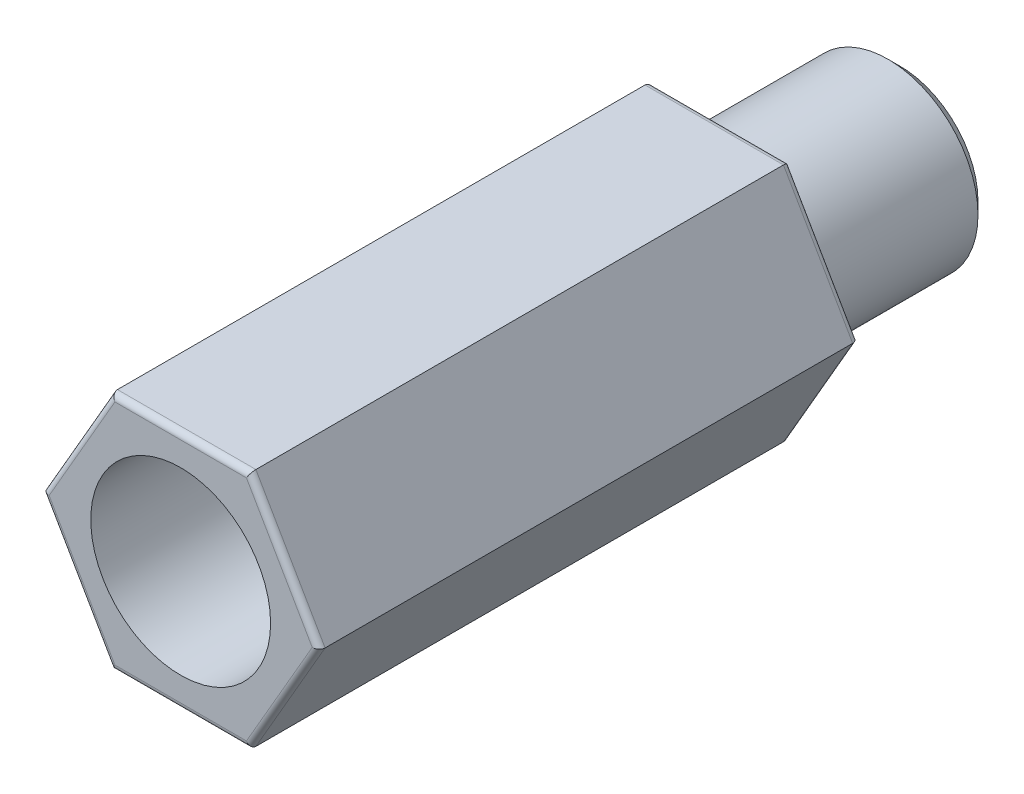
ISO-10303-21;
HEADER;
FILE_DESCRIPTION(('STEP AP214'),'2;1');
FILE_NAME('part.step','',(''),(''),'','','');
FILE_SCHEMA(('AUTOMOTIVE_DESIGN { 1 0 10303 214 1 1 1 1 }'));
ENDSEC;
DATA;
#1=APPLICATION_CONTEXT('core data for automotive mechanical design processes');
#2=APPLICATION_PROTOCOL_DEFINITION('international standard','automotive_design',2000,#1);
#3=PRODUCT_CONTEXT('',#1,'mechanical');
#4=PRODUCT('Part','Part','',(#3));
#5=PRODUCT_RELATED_PRODUCT_CATEGORY('part','',(#4));
#6=PRODUCT_DEFINITION_FORMATION('','',#4);
#7=PRODUCT_DEFINITION_CONTEXT('part definition',#1,'design');
#8=PRODUCT_DEFINITION('design','',#6,#7);
#9=PRODUCT_DEFINITION_SHAPE('','',#8);
#10=(LENGTH_UNIT() NAMED_UNIT(*) SI_UNIT(.MILLI.,.METRE.));
#11=(NAMED_UNIT(*) PLANE_ANGLE_UNIT() SI_UNIT($,.RADIAN.));
#12=(NAMED_UNIT(*) SI_UNIT($,.STERADIAN.) SOLID_ANGLE_UNIT());
#13=UNCERTAINTY_MEASURE_WITH_UNIT(LENGTH_MEASURE(1.E-05),#10,'distance_accuracy_value','');
#14=(GEOMETRIC_REPRESENTATION_CONTEXT(3) GLOBAL_UNCERTAINTY_ASSIGNED_CONTEXT((#13)) GLOBAL_UNIT_ASSIGNED_CONTEXT((#10,
#11,#12)) REPRESENTATION_CONTEXT('',''));
#15=CARTESIAN_POINT('',(0.,0.,0.));
#16=DIRECTION('',(0.,0.,1.));
#17=DIRECTION('',(1.,0.,0.));
#18=AXIS2_PLACEMENT_3D('',#15,#16,#17);
#19=CARTESIAN_POINT('',(0.,0.,12.));
#20=DIRECTION('',(0.,0.,1.));
#21=DIRECTION('',(1.,0.,0.));
#22=AXIS2_PLACEMENT_3D('',#19,#20,#21);
#23=PLANE('',#22);
#24=DIRECTION('',(1.,0.,0.));
#25=VECTOR('',#24,1.);
#26=CARTESIAN_POINT('',(1.15470053837925,-1.9,12.));
#27=LINE('',#26,#25);
#28=CARTESIAN_POINT('',(-1.09696551146029,-1.9,12.));
#29=VERTEX_POINT('',#28);
#30=CARTESIAN_POINT('',(1.09696551146029,-1.9,12.));
#31=VERTEX_POINT('',#30);
#32=EDGE_CURVE('E55',#29,#31,#27,.T.);
#33=ORIENTED_EDGE('',*,*,#32,.T.);
#34=DIRECTION('',(0.5,0.866025403784439,0.));
#35=VECTOR('',#34,1.);
#36=CARTESIAN_POINT('',(2.22279853638006,0.0500000000000011,12.));
#37=LINE('',#36,#35);
#38=CARTESIAN_POINT('',(2.19393102292058,0.,12.));
#39=VERTEX_POINT('',#38);
#40=EDGE_CURVE('E12',#31,#39,#37,.T.);
#41=ORIENTED_EDGE('',*,*,#40,.T.);
#42=DIRECTION('',(-0.5,0.866025403784438,0.));
#43=VECTOR('',#42,1.);
#44=CARTESIAN_POINT('',(1.06809799800081,1.95,12.));
#45=LINE('',#44,#43);
#46=CARTESIAN_POINT('',(1.09696551146029,1.9,12.));
#47=VERTEX_POINT('',#46);
#48=EDGE_CURVE('E197',#39,#47,#45,.T.);
#49=ORIENTED_EDGE('',*,*,#48,.T.);
#50=DIRECTION('',(-1.,0.,0.));
#51=VECTOR('',#50,1.);
#52=CARTESIAN_POINT('',(-1.15470053837925,1.9,12.));
#53=LINE('',#52,#51);
#54=CARTESIAN_POINT('',(-1.09696551146029,1.9,12.));
#55=VERTEX_POINT('',#54);
#56=EDGE_CURVE('E199',#47,#55,#53,.T.);
#57=ORIENTED_EDGE('',*,*,#56,.T.);
#58=DIRECTION('',(-0.5,-0.866025403784439,0.));
#59=VECTOR('',#58,1.);
#60=CARTESIAN_POINT('',(-2.22279853638006,-0.0499999999999996,12.));
#61=LINE('',#60,#59);
#62=CARTESIAN_POINT('',(-2.19393102292058,0.,12.));
#63=VERTEX_POINT('',#62);
#64=EDGE_CURVE('E201',#55,#63,#61,.T.);
#65=ORIENTED_EDGE('',*,*,#64,.T.);
#66=DIRECTION('',(0.5,-0.866025403784439,0.));
#67=VECTOR('',#66,1.);
#68=CARTESIAN_POINT('',(-1.06809799800081,-1.95,12.));
#69=LINE('',#68,#67);
#70=EDGE_CURVE('E66',#63,#29,#69,.T.);
#71=ORIENTED_EDGE('',*,*,#70,.T.);
#72=EDGE_LOOP('',(#33,#41,#49,#57,#65,#71));
#73=FACE_BOUND('',#72,.T.);
#74=CARTESIAN_POINT('',(0.,0.,12.));
#75=DIRECTION('',(0.,0.,1.));
#76=DIRECTION('',(1.,0.,0.));
#77=AXIS2_PLACEMENT_3D('',#74,#75,#76);
#78=CIRCLE('',#77,1.5);
#79=CARTESIAN_POINT('',(1.5,0.,12.));
#80=VERTEX_POINT('',#79);
#81=EDGE_CURVE('E215',#80,#80,#78,.T.);
#82=ORIENTED_EDGE('',*,*,#81,.F.);
#83=EDGE_LOOP('',(#82));
#84=FACE_BOUND('',#83,.T.);
#85=ADVANCED_FACE('F46',(#73,#84),#23,.T.);
#86=CARTESIAN_POINT('',(0.,0.,3.));
#87=DIRECTION('',(0.,0.,1.));
#88=DIRECTION('',(1.,0.,0.));
#89=AXIS2_PLACEMENT_3D('',#86,#87,#88);
#90=PLANE('',#89);
#91=CARTESIAN_POINT('',(0.,0.,3.));
#92=DIRECTION('',(0.,0.,1.));
#93=DIRECTION('',(1.,0.,0.));
#94=AXIS2_PLACEMENT_3D('',#91,#92,#93);
#95=CIRCLE('',#94,1.6);
#96=CARTESIAN_POINT('',(1.6,0.,3.));
#97=VERTEX_POINT('',#96);
#98=EDGE_CURVE('E162',#97,#97,#95,.T.);
#99=ORIENTED_EDGE('',*,*,#98,.T.);
#100=EDGE_LOOP('',(#99));
#101=FACE_BOUND('',#100,.T.);
#102=DIRECTION('',(-1.,0.,0.));
#103=VECTOR('',#102,1.);
#104=CARTESIAN_POINT('',(0.,1.9,3.));
#105=LINE('',#104,#103);
#106=CARTESIAN_POINT('',(-1.09696551146029,1.9,3.));
#107=VERTEX_POINT('',#106);
#108=CARTESIAN_POINT('',(1.09696551146029,1.9,3.));
#109=VERTEX_POINT('',#108);
#110=EDGE_CURVE('E161',#107,#109,#105,.F.);
#111=ORIENTED_EDGE('',*,*,#110,.T.);
#112=DIRECTION('',(-0.5,0.866025403784438,0.));
#113=VECTOR('',#112,1.);
#114=CARTESIAN_POINT('',(1.64544826719043,0.950000000000001,3.));
#115=LINE('',#114,#113);
#116=CARTESIAN_POINT('',(2.19393102292058,0.,3.));
#117=VERTEX_POINT('',#116);
#118=EDGE_CURVE('E140',#109,#117,#115,.F.);
#119=ORIENTED_EDGE('',*,*,#118,.T.);
#120=DIRECTION('',(0.5,0.866025403784439,0.));
#121=VECTOR('',#120,1.);
#122=CARTESIAN_POINT('',(1.64544826719043,-0.95,3.));
#123=LINE('',#122,#121);
#124=CARTESIAN_POINT('',(1.09696551146029,-1.9,3.));
#125=VERTEX_POINT('',#124);
#126=EDGE_CURVE('E150',#117,#125,#123,.F.);
#127=ORIENTED_EDGE('',*,*,#126,.T.);
#128=DIRECTION('',(1.,0.,0.));
#129=VECTOR('',#128,1.);
#130=CARTESIAN_POINT('',(0.,-1.9,3.));
#131=LINE('',#130,#129);
#132=CARTESIAN_POINT('',(-1.09696551146029,-1.9,3.));
#133=VERTEX_POINT('',#132);
#134=EDGE_CURVE('E156',#125,#133,#131,.F.);
#135=ORIENTED_EDGE('',*,*,#134,.T.);
#136=DIRECTION('',(0.5,-0.866025403784439,0.));
#137=VECTOR('',#136,1.);
#138=CARTESIAN_POINT('',(-1.64544826719043,-0.95,3.));
#139=LINE('',#138,#137);
#140=CARTESIAN_POINT('',(-2.19393102292058,0.,3.));
#141=VERTEX_POINT('',#140);
#142=EDGE_CURVE('E263',#133,#141,#139,.F.);
#143=ORIENTED_EDGE('',*,*,#142,.T.);
#144=DIRECTION('',(-0.5,-0.866025403784439,0.));
#145=VECTOR('',#144,1.);
#146=CARTESIAN_POINT('',(-1.64544826719043,0.95,3.));
#147=LINE('',#146,#145);
#148=EDGE_CURVE('E167',#141,#107,#147,.F.);
#149=ORIENTED_EDGE('',*,*,#148,.T.);
#150=EDGE_LOOP('',(#111,#119,#127,#135,#143,#149));
#151=FACE_BOUND('',#150,.T.);
#152=ADVANCED_FACE('F159',(#101,#151),#90,.F.);
#153=CARTESIAN_POINT('',(1.15470053837925,-2.,12.));
#154=DIRECTION('',(-0.866025403784439,0.5,0.));
#155=DIRECTION('',(-0.5,-0.866025403784439,0.));
#156=AXIS2_PLACEMENT_3D('',#153,#154,#155);
#157=PLANE('',#156);
#158=DIRECTION('',(0.,0.,-1.));
#159=VECTOR('',#158,1.);
#160=CARTESIAN_POINT('',(1.15470053837925,-2.,12.));
#161=LINE('',#160,#159);
#162=CARTESIAN_POINT('',(1.15470053837925,-2.,11.9));
#163=VERTEX_POINT('',#162);
#164=CARTESIAN_POINT('',(1.15470053837925,-2.,3.1));
#165=VERTEX_POINT('',#164);
#166=EDGE_CURVE('E296',#163,#165,#161,.T.);
#167=ORIENTED_EDGE('',*,*,#166,.T.);
#168=DIRECTION('',(0.5,0.866025403784439,0.));
#169=VECTOR('',#168,1.);
#170=CARTESIAN_POINT('',(1.15470053837925,-2.,3.1));
#171=LINE('',#170,#169);
#172=CARTESIAN_POINT('',(2.3094010767585,0.,3.1));
#173=VERTEX_POINT('',#172);
#174=EDGE_CURVE('E195',#165,#173,#171,.T.);
#175=ORIENTED_EDGE('',*,*,#174,.T.);
#176=DIRECTION('',(0.,0.,-1.));
#177=VECTOR('',#176,1.);
#178=CARTESIAN_POINT('',(2.3094010767585,0.,12.));
#179=LINE('',#178,#177);
#180=CARTESIAN_POINT('',(2.3094010767585,0.,11.9));
#181=VERTEX_POINT('',#180);
#182=EDGE_CURVE('E157',#181,#173,#179,.T.);
#183=ORIENTED_EDGE('',*,*,#182,.F.);
#184=DIRECTION('',(0.5,0.866025403784439,0.));
#185=VECTOR('',#184,1.);
#186=CARTESIAN_POINT('',(1.15470053837925,-2.,11.9));
#187=LINE('',#186,#185);
#188=EDGE_CURVE('E192',#181,#163,#187,.F.);
#189=ORIENTED_EDGE('',*,*,#188,.T.);
#190=EDGE_LOOP('',(#167,#175,#183,#189));
#191=FACE_BOUND('',#190,.T.);
#192=ADVANCED_FACE('F280',(#191),#157,.F.);
#193=CARTESIAN_POINT('',(2.3094010767585,0.,12.));
#194=DIRECTION('',(-0.866025403784438,-0.5,0.));
#195=DIRECTION('',(0.5,-0.866025403784438,0.));
#196=AXIS2_PLACEMENT_3D('',#193,#194,#195);
#197=PLANE('',#196);
#198=ORIENTED_EDGE('',*,*,#182,.T.);
#199=DIRECTION('',(-0.5,0.866025403784438,0.));
#200=VECTOR('',#199,1.);
#201=CARTESIAN_POINT('',(2.3094010767585,0.,3.1));
#202=LINE('',#201,#200);
#203=CARTESIAN_POINT('',(1.15470053837925,2.,3.1));
#204=VERTEX_POINT('',#203);
#205=EDGE_CURVE('E143',#173,#204,#202,.T.);
#206=ORIENTED_EDGE('',*,*,#205,.T.);
#207=DIRECTION('',(0.,0.,-1.));
#208=VECTOR('',#207,1.);
#209=CARTESIAN_POINT('',(1.15470053837925,2.,12.));
#210=LINE('',#209,#208);
#211=CARTESIAN_POINT('',(1.15470053837925,2.,11.9));
#212=VERTEX_POINT('',#211);
#213=EDGE_CURVE('E253',#212,#204,#210,.T.);
#214=ORIENTED_EDGE('',*,*,#213,.F.);
#215=DIRECTION('',(-0.5,0.866025403784438,0.));
#216=VECTOR('',#215,1.);
#217=CARTESIAN_POINT('',(2.3094010767585,0.,11.9));
#218=LINE('',#217,#216);
#219=EDGE_CURVE('E173',#212,#181,#218,.F.);
#220=ORIENTED_EDGE('',*,*,#219,.T.);
#221=EDGE_LOOP('',(#198,#206,#214,#220));
#222=FACE_BOUND('',#221,.T.);
#223=ADVANCED_FACE('F273',(#222),#197,.F.);
#224=CARTESIAN_POINT('',(1.15470053837925,2.,12.));
#225=DIRECTION('',(0.,-1.,0.));
#226=DIRECTION('',(0.,0.,-1.));
#227=AXIS2_PLACEMENT_3D('',#224,#225,#226);
#228=PLANE('',#227);
#229=ORIENTED_EDGE('',*,*,#213,.T.);
#230=DIRECTION('',(-1.,0.,0.));
#231=VECTOR('',#230,1.);
#232=CARTESIAN_POINT('',(1.15470053837925,2.,3.1));
#233=LINE('',#232,#231);
#234=CARTESIAN_POINT('',(-1.15470053837925,2.,3.1));
#235=VERTEX_POINT('',#234);
#236=EDGE_CURVE('E178',#204,#235,#233,.T.);
#237=ORIENTED_EDGE('',*,*,#236,.T.);
#238=DIRECTION('',(0.,0.,-1.));
#239=VECTOR('',#238,1.);
#240=CARTESIAN_POINT('',(-1.15470053837925,2.,12.));
#241=LINE('',#240,#239);
#242=CARTESIAN_POINT('',(-1.15470053837925,2.,11.9));
#243=VERTEX_POINT('',#242);
#244=EDGE_CURVE('E244',#243,#235,#241,.T.);
#245=ORIENTED_EDGE('',*,*,#244,.F.);
#246=DIRECTION('',(-1.,0.,0.));
#247=VECTOR('',#246,1.);
#248=CARTESIAN_POINT('',(1.15470053837925,2.,11.9));
#249=LINE('',#248,#247);
#250=EDGE_CURVE('E176',#243,#212,#249,.F.);
#251=ORIENTED_EDGE('',*,*,#250,.T.);
#252=EDGE_LOOP('',(#229,#237,#245,#251));
#253=FACE_BOUND('',#252,.T.);
#254=ADVANCED_FACE('F250',(#253),#228,.F.);
#255=CARTESIAN_POINT('',(-1.15470053837925,2.,12.));
#256=DIRECTION('',(0.866025403784439,-0.5,0.));
#257=DIRECTION('',(0.5,0.866025403784439,0.));
#258=AXIS2_PLACEMENT_3D('',#255,#256,#257);
#259=PLANE('',#258);
#260=ORIENTED_EDGE('',*,*,#244,.T.);
#261=DIRECTION('',(-0.5,-0.866025403784439,0.));
#262=VECTOR('',#261,1.);
#263=CARTESIAN_POINT('',(-1.15470053837925,2.,3.1));
#264=LINE('',#263,#262);
#265=CARTESIAN_POINT('',(-2.3094010767585,0.,3.1));
#266=VERTEX_POINT('',#265);
#267=EDGE_CURVE('E182',#235,#266,#264,.T.);
#268=ORIENTED_EDGE('',*,*,#267,.T.);
#269=DIRECTION('',(0.,0.,-1.));
#270=VECTOR('',#269,1.);
#271=CARTESIAN_POINT('',(-2.3094010767585,0.,12.));
#272=LINE('',#271,#270);
#273=CARTESIAN_POINT('',(-2.3094010767585,0.,11.9));
#274=VERTEX_POINT('',#273);
#275=EDGE_CURVE('E247',#274,#266,#272,.T.);
#276=ORIENTED_EDGE('',*,*,#275,.F.);
#277=DIRECTION('',(-0.5,-0.866025403784439,0.));
#278=VECTOR('',#277,1.);
#279=CARTESIAN_POINT('',(-1.15470053837925,2.,11.9));
#280=LINE('',#279,#278);
#281=EDGE_CURVE('E180',#274,#243,#280,.F.);
#282=ORIENTED_EDGE('',*,*,#281,.T.);
#283=EDGE_LOOP('',(#260,#268,#276,#282));
#284=FACE_BOUND('',#283,.T.);
#285=ADVANCED_FACE('F243',(#284),#259,.F.);
#286=CARTESIAN_POINT('',(-2.3094010767585,0.,12.));
#287=DIRECTION('',(0.866025403784438,0.5,0.));
#288=DIRECTION('',(-0.5,0.866025403784439,0.));
#289=AXIS2_PLACEMENT_3D('',#286,#287,#288);
#290=PLANE('',#289);
#291=ORIENTED_EDGE('',*,*,#275,.T.);
#292=DIRECTION('',(0.5,-0.866025403784439,0.));
#293=VECTOR('',#292,1.);
#294=CARTESIAN_POINT('',(-2.3094010767585,0.,3.1));
#295=LINE('',#294,#293);
#296=CARTESIAN_POINT('',(-1.15470053837925,-2.,3.1));
#297=VERTEX_POINT('',#296);
#298=EDGE_CURVE('E186',#266,#297,#295,.T.);
#299=ORIENTED_EDGE('',*,*,#298,.T.);
#300=DIRECTION('',(0.,0.,-1.));
#301=VECTOR('',#300,1.);
#302=CARTESIAN_POINT('',(-1.15470053837925,-2.,12.));
#303=LINE('',#302,#301);
#304=CARTESIAN_POINT('',(-1.15470053837925,-2.,11.9));
#305=VERTEX_POINT('',#304);
#306=EDGE_CURVE('E256',#305,#297,#303,.T.);
#307=ORIENTED_EDGE('',*,*,#306,.F.);
#308=DIRECTION('',(0.5,-0.866025403784439,0.));
#309=VECTOR('',#308,1.);
#310=CARTESIAN_POINT('',(-2.3094010767585,0.,11.9));
#311=LINE('',#310,#309);
#312=EDGE_CURVE('E184',#305,#274,#311,.F.);
#313=ORIENTED_EDGE('',*,*,#312,.T.);
#314=EDGE_LOOP('',(#291,#299,#307,#313));
#315=FACE_BOUND('',#314,.T.);
#316=ADVANCED_FACE('F454',(#315),#290,.F.);
#317=CARTESIAN_POINT('',(-1.15470053837925,-2.,12.));
#318=DIRECTION('',(0.,1.,0.));
#319=DIRECTION('',(-1.,0.,0.));
#320=AXIS2_PLACEMENT_3D('',#317,#318,#319);
#321=PLANE('',#320);
#322=ORIENTED_EDGE('',*,*,#306,.T.);
#323=DIRECTION('',(1.,0.,0.));
#324=VECTOR('',#323,1.);
#325=CARTESIAN_POINT('',(-1.15470053837925,-2.,3.1));
#326=LINE('',#325,#324);
#327=EDGE_CURVE('E190',#297,#165,#326,.T.);
#328=ORIENTED_EDGE('',*,*,#327,.T.);
#329=ORIENTED_EDGE('',*,*,#166,.F.);
#330=DIRECTION('',(1.,0.,0.));
#331=VECTOR('',#330,1.);
#332=CARTESIAN_POINT('',(-1.15470053837925,-2.,11.9));
#333=LINE('',#332,#331);
#334=EDGE_CURVE('E188',#163,#305,#333,.F.);
#335=ORIENTED_EDGE('',*,*,#334,.T.);
#336=EDGE_LOOP('',(#322,#328,#329,#335));
#337=FACE_BOUND('',#336,.T.);
#338=ADVANCED_FACE('F303',(#337),#321,.F.);
#339=CARTESIAN_POINT('',(0.,0.,12.));
#340=DIRECTION('',(0.,0.,-1.));
#341=DIRECTION('',(-1.,0.,0.));
#342=AXIS2_PLACEMENT_3D('',#339,#340,#341);
#343=CYLINDRICAL_SURFACE('',#342,1.5);
#344=CARTESIAN_POINT('',(0.,0.,3.1));
#345=DIRECTION('',(0.,0.,1.));
#346=DIRECTION('',(1.,0.,0.));
#347=AXIS2_PLACEMENT_3D('',#344,#345,#346);
#348=CIRCLE('',#347,1.5);
#349=CARTESIAN_POINT('',(1.5,0.,3.1));
#350=VERTEX_POINT('',#349);
#351=EDGE_CURVE('E165',#350,#350,#348,.F.);
#352=ORIENTED_EDGE('',*,*,#351,.T.);
#353=EDGE_LOOP('',(#352));
#354=FACE_BOUND('',#353,.T.);
#355=ORIENTED_EDGE('',*,*,#81,.T.);
#356=EDGE_LOOP('',(#355));
#357=FACE_BOUND('',#356,.T.);
#358=ADVANCED_FACE('F436',(#354,#357),#343,.F.);
#359=CARTESIAN_POINT('',(0.,0.,3.1));
#360=DIRECTION('',(0.,0.,1.));
#361=DIRECTION('',(1.,0.,0.));
#362=AXIS2_PLACEMENT_3D('',#359,#360,#361);
#363=TOROIDAL_SURFACE('',#362,1.6,0.1);
#364=ORIENTED_EDGE('',*,*,#351,.F.);
#365=EDGE_LOOP('',(#364));
#366=FACE_BOUND('',#365,.T.);
#367=ORIENTED_EDGE('',*,*,#98,.F.);
#368=EDGE_LOOP('',(#367));
#369=FACE_BOUND('',#368,.T.);
#370=ADVANCED_FACE('F318',(#366,#369),#363,.T.);
#371=CARTESIAN_POINT('',(-2.22279853638006,0.0500000000000004,3.1));
#372=DIRECTION('',(0.5,-0.866025403784439,0.));
#373=DIRECTION('',(0.866025403784438,0.5,0.));
#374=AXIS2_PLACEMENT_3D('',#371,#372,#373);
#375=CYLINDRICAL_SURFACE('',#374,0.1);
#376=CARTESIAN_POINT('',(-2.19393102292058,0.,3.1));
#377=DIRECTION('',(0.,-1.,0.));
#378=DIRECTION('',(1.,0.,0.));
#379=AXIS2_PLACEMENT_3D('',#376,#377,#378);
#380=ELLIPSE('',#379,0.115470053837925,0.1);
#381=EDGE_CURVE('E209',#141,#266,#380,.F.);
#382=ORIENTED_EDGE('',*,*,#381,.F.);
#383=ORIENTED_EDGE('',*,*,#142,.F.);
#384=CARTESIAN_POINT('',(-1.09696551146029,-1.9,3.1));
#385=DIRECTION('',(0.866025403784439,-0.5,0.));
#386=DIRECTION('',(0.5,0.866025403784439,0.));
#387=AXIS2_PLACEMENT_3D('',#384,#385,#386);
#388=ELLIPSE('',#387,0.115470053837925,0.1);
#389=EDGE_CURVE('E212',#297,#133,#388,.T.);
#390=ORIENTED_EDGE('',*,*,#389,.F.);
#391=ORIENTED_EDGE('',*,*,#298,.F.);
#392=EDGE_LOOP('',(#382,#383,#390,#391));
#393=FACE_BOUND('',#392,.T.);
#394=ADVANCED_FACE('F308',(#393),#375,.T.);
#395=CARTESIAN_POINT('',(-1.15470053837925,-1.9,3.1));
#396=DIRECTION('',(1.,0.,0.));
#397=DIRECTION('',(0.,1.,0.));
#398=AXIS2_PLACEMENT_3D('',#395,#396,#397);
#399=CYLINDRICAL_SURFACE('',#398,0.1);
#400=ORIENTED_EDGE('',*,*,#389,.T.);
#401=ORIENTED_EDGE('',*,*,#134,.F.);
#402=CARTESIAN_POINT('',(1.09696551146029,-1.9,3.1));
#403=DIRECTION('',(0.866025403784439,0.5,0.));
#404=DIRECTION('',(-0.5,0.866025403784439,0.));
#405=AXIS2_PLACEMENT_3D('',#402,#403,#404);
#406=ELLIPSE('',#405,0.115470053837925,0.1);
#407=EDGE_CURVE('E153',#165,#125,#406,.T.);
#408=ORIENTED_EDGE('',*,*,#407,.F.);
#409=ORIENTED_EDGE('',*,*,#327,.F.);
#410=EDGE_LOOP('',(#400,#401,#408,#409));
#411=FACE_BOUND('',#410,.T.);
#412=ADVANCED_FACE('F310',(#411),#399,.T.);
#413=CARTESIAN_POINT('',(-1.06809799800081,1.95,3.1));
#414=DIRECTION('',(-0.5,-0.866025403784439,0.));
#415=DIRECTION('',(0.866025403784439,-0.5,0.));
#416=AXIS2_PLACEMENT_3D('',#413,#414,#415);
#417=CYLINDRICAL_SURFACE('',#416,0.1);
#418=ORIENTED_EDGE('',*,*,#381,.T.);
#419=ORIENTED_EDGE('',*,*,#267,.F.);
#420=CARTESIAN_POINT('',(-1.09696551146029,1.9,3.1));
#421=DIRECTION('',(-0.866025403784439,-0.5,0.));
#422=DIRECTION('',(0.5,-0.866025403784439,0.));
#423=AXIS2_PLACEMENT_3D('',#420,#421,#422);
#424=ELLIPSE('',#423,0.115470053837925,0.1);
#425=EDGE_CURVE('E146',#107,#235,#424,.F.);
#426=ORIENTED_EDGE('',*,*,#425,.F.);
#427=ORIENTED_EDGE('',*,*,#148,.F.);
#428=EDGE_LOOP('',(#418,#419,#426,#427));
#429=FACE_BOUND('',#428,.T.);
#430=ADVANCED_FACE('F269',(#429),#417,.T.);
#431=CARTESIAN_POINT('',(1.06809799800081,-1.95,3.1));
#432=DIRECTION('',(0.5,0.866025403784439,0.));
#433=DIRECTION('',(-0.866025403784439,0.5,0.));
#434=AXIS2_PLACEMENT_3D('',#431,#432,#433);
#435=CYLINDRICAL_SURFACE('',#434,0.1);
#436=ORIENTED_EDGE('',*,*,#407,.T.);
#437=ORIENTED_EDGE('',*,*,#126,.F.);
#438=CARTESIAN_POINT('',(2.19393102292058,0.,3.1));
#439=DIRECTION('',(0.,1.,0.));
#440=DIRECTION('',(1.,0.,0.));
#441=AXIS2_PLACEMENT_3D('',#438,#439,#440);
#442=ELLIPSE('',#441,0.115470053837925,0.1);
#443=EDGE_CURVE('E136',#173,#117,#442,.T.);
#444=ORIENTED_EDGE('',*,*,#443,.F.);
#445=ORIENTED_EDGE('',*,*,#174,.F.);
#446=EDGE_LOOP('',(#436,#437,#444,#445));
#447=FACE_BOUND('',#446,.T.);
#448=ADVANCED_FACE('F151',(#447),#435,.T.);
#449=CARTESIAN_POINT('',(1.15470053837925,1.9,3.1));
#450=DIRECTION('',(-1.,0.,0.));
#451=DIRECTION('',(0.,0.,1.));
#452=AXIS2_PLACEMENT_3D('',#449,#450,#451);
#453=CYLINDRICAL_SURFACE('',#452,0.1);
#454=ORIENTED_EDGE('',*,*,#425,.T.);
#455=ORIENTED_EDGE('',*,*,#236,.F.);
#456=CARTESIAN_POINT('',(1.09696551146029,1.9,3.1));
#457=DIRECTION('',(-0.866025403784439,0.5,0.));
#458=DIRECTION('',(-0.5,-0.866025403784439,0.));
#459=AXIS2_PLACEMENT_3D('',#456,#457,#458);
#460=ELLIPSE('',#459,0.115470053837925,0.1);
#461=EDGE_CURVE('E147',#109,#204,#460,.F.);
#462=ORIENTED_EDGE('',*,*,#461,.F.);
#463=ORIENTED_EDGE('',*,*,#110,.F.);
#464=EDGE_LOOP('',(#454,#455,#462,#463));
#465=FACE_BOUND('',#464,.T.);
#466=ADVANCED_FACE('F271',(#465),#453,.T.);
#467=CARTESIAN_POINT('',(2.22279853638006,-0.0499999999999996,3.1));
#468=DIRECTION('',(-0.5,0.866025403784438,0.));
#469=DIRECTION('',(-0.866025403784438,-0.5,0.));
#470=AXIS2_PLACEMENT_3D('',#467,#468,#469);
#471=CYLINDRICAL_SURFACE('',#470,0.1);
#472=ORIENTED_EDGE('',*,*,#443,.T.);
#473=ORIENTED_EDGE('',*,*,#118,.F.);
#474=ORIENTED_EDGE('',*,*,#461,.T.);
#475=ORIENTED_EDGE('',*,*,#205,.F.);
#476=EDGE_LOOP('',(#472,#473,#474,#475));
#477=FACE_BOUND('',#476,.T.);
#478=ADVANCED_FACE('F138',(#477),#471,.T.);
#479=CARTESIAN_POINT('',(-1.64544826719043,0.95,11.9));
#480=DIRECTION('',(0.5,0.866025403784439,0.));
#481=DIRECTION('',(-0.866025403784439,0.5,0.));
#482=AXIS2_PLACEMENT_3D('',#479,#480,#481);
#483=CYLINDRICAL_SURFACE('',#482,0.1);
#484=CARTESIAN_POINT('',(-1.09696551146029,1.9,11.9));
#485=DIRECTION('',(0.866025403784439,0.5,0.));
#486=DIRECTION('',(0.5,-0.866025403784439,0.));
#487=AXIS2_PLACEMENT_3D('',#484,#485,#486);
#488=ELLIPSE('',#487,0.115470053837925,0.1);
#489=EDGE_CURVE('E225',#243,#55,#488,.T.);
#490=ORIENTED_EDGE('',*,*,#489,.F.);
#491=ORIENTED_EDGE('',*,*,#281,.F.);
#492=CARTESIAN_POINT('',(-2.19393102292058,0.,11.9));
#493=DIRECTION('',(0.,1.,0.));
#494=DIRECTION('',(1.,0.,0.));
#495=AXIS2_PLACEMENT_3D('',#492,#493,#494);
#496=ELLIPSE('',#495,0.115470053837925,0.1);
#497=EDGE_CURVE('E50',#63,#274,#496,.F.);
#498=ORIENTED_EDGE('',*,*,#497,.F.);
#499=ORIENTED_EDGE('',*,*,#64,.F.);
#500=EDGE_LOOP('',(#490,#491,#498,#499));
#501=FACE_BOUND('',#500,.T.);
#502=ADVANCED_FACE('F48',(#501),#483,.T.);
#503=CARTESIAN_POINT('',(-1.64544826719043,-0.95,11.9));
#504=DIRECTION('',(-0.5,0.866025403784439,0.));
#505=DIRECTION('',(-0.866025403784438,-0.5,0.));
#506=AXIS2_PLACEMENT_3D('',#503,#504,#505);
#507=CYLINDRICAL_SURFACE('',#506,0.1);
#508=ORIENTED_EDGE('',*,*,#497,.T.);
#509=ORIENTED_EDGE('',*,*,#312,.F.);
#510=CARTESIAN_POINT('',(-1.09696551146029,-1.9,11.9));
#511=DIRECTION('',(-0.866025403784439,0.5,0.));
#512=DIRECTION('',(0.5,0.866025403784439,0.));
#513=AXIS2_PLACEMENT_3D('',#510,#511,#512);
#514=ELLIPSE('',#513,0.115470053837925,0.1);
#515=EDGE_CURVE('E223',#29,#305,#514,.F.);
#516=ORIENTED_EDGE('',*,*,#515,.F.);
#517=ORIENTED_EDGE('',*,*,#70,.F.);
#518=EDGE_LOOP('',(#508,#509,#516,#517));
#519=FACE_BOUND('',#518,.T.);
#520=ADVANCED_FACE('F235',(#519),#507,.T.);
#521=CARTESIAN_POINT('',(0.,1.9,11.9));
#522=DIRECTION('',(1.,0.,0.));
#523=DIRECTION('',(0.,0.,-1.));
#524=AXIS2_PLACEMENT_3D('',#521,#522,#523);
#525=CYLINDRICAL_SURFACE('',#524,0.1);
#526=ORIENTED_EDGE('',*,*,#489,.T.);
#527=ORIENTED_EDGE('',*,*,#56,.F.);
#528=CARTESIAN_POINT('',(1.09696551146029,1.9,11.9));
#529=DIRECTION('',(0.866025403784439,-0.5,0.));
#530=DIRECTION('',(-0.5,-0.866025403784439,0.));
#531=AXIS2_PLACEMENT_3D('',#528,#529,#530);
#532=ELLIPSE('',#531,0.115470053837925,0.1);
#533=EDGE_CURVE('E220',#212,#47,#532,.T.);
#534=ORIENTED_EDGE('',*,*,#533,.F.);
#535=ORIENTED_EDGE('',*,*,#250,.F.);
#536=EDGE_LOOP('',(#526,#527,#534,#535));
#537=FACE_BOUND('',#536,.T.);
#538=ADVANCED_FACE('F329',(#537),#525,.T.);
#539=CARTESIAN_POINT('',(0.,-1.9,11.9));
#540=DIRECTION('',(-1.,0.,0.));
#541=DIRECTION('',(0.,-1.,0.));
#542=AXIS2_PLACEMENT_3D('',#539,#540,#541);
#543=CYLINDRICAL_SURFACE('',#542,0.1);
#544=ORIENTED_EDGE('',*,*,#515,.T.);
#545=ORIENTED_EDGE('',*,*,#334,.F.);
#546=CARTESIAN_POINT('',(1.09696551146029,-1.9,11.9));
#547=DIRECTION('',(-0.866025403784439,-0.5,0.));
#548=DIRECTION('',(-0.5,0.866025403784439,0.));
#549=AXIS2_PLACEMENT_3D('',#546,#547,#548);
#550=ELLIPSE('',#549,0.115470053837925,0.1);
#551=EDGE_CURVE('E218',#31,#163,#550,.F.);
#552=ORIENTED_EDGE('',*,*,#551,.F.);
#553=ORIENTED_EDGE('',*,*,#32,.F.);
#554=EDGE_LOOP('',(#544,#545,#552,#553));
#555=FACE_BOUND('',#554,.T.);
#556=ADVANCED_FACE('F326',(#555),#543,.T.);
#557=CARTESIAN_POINT('',(1.64544826719043,0.950000000000001,11.9));
#558=DIRECTION('',(0.5,-0.866025403784438,0.));
#559=DIRECTION('',(0.866025403784438,0.5,0.));
#560=AXIS2_PLACEMENT_3D('',#557,#558,#559);
#561=CYLINDRICAL_SURFACE('',#560,0.1);
#562=ORIENTED_EDGE('',*,*,#533,.T.);
#563=ORIENTED_EDGE('',*,*,#48,.F.);
#564=CARTESIAN_POINT('',(2.19393102292058,0.,11.9));
#565=DIRECTION('',(0.,-1.,0.));
#566=DIRECTION('',(1.,0.,0.));
#567=AXIS2_PLACEMENT_3D('',#564,#565,#566);
#568=ELLIPSE('',#567,0.115470053837925,0.1);
#569=EDGE_CURVE('E216',#181,#39,#568,.T.);
#570=ORIENTED_EDGE('',*,*,#569,.F.);
#571=ORIENTED_EDGE('',*,*,#219,.F.);
#572=EDGE_LOOP('',(#562,#563,#570,#571));
#573=FACE_BOUND('',#572,.T.);
#574=ADVANCED_FACE('F289',(#573),#561,.T.);
#575=CARTESIAN_POINT('',(1.64544826719043,-0.95,11.9));
#576=DIRECTION('',(-0.5,-0.866025403784439,0.));
#577=DIRECTION('',(0.866025403784439,-0.5,0.));
#578=AXIS2_PLACEMENT_3D('',#575,#576,#577);
#579=CYLINDRICAL_SURFACE('',#578,0.1);
#580=ORIENTED_EDGE('',*,*,#551,.T.);
#581=ORIENTED_EDGE('',*,*,#188,.F.);
#582=ORIENTED_EDGE('',*,*,#569,.T.);
#583=ORIENTED_EDGE('',*,*,#40,.F.);
#584=EDGE_LOOP('',(#580,#581,#582,#583));
#585=FACE_BOUND('',#584,.T.);
#586=ADVANCED_FACE('F284',(#585),#579,.T.);
#587=CLOSED_SHELL('',(#85,#152,#192,#223,#254,#285,#316,#338,#358,#370,#394,#412,#430,#448,#466,
#478,#502,#520,#538,#556,#574,#586));
#588=MANIFOLD_SOLID_BREP('B2',#587);
#589=CARTESIAN_POINT('',(0.,0.,3.));
#590=DIRECTION('',(0.,0.,-1.));
#591=DIRECTION('',(-1.,0.,0.));
#592=AXIS2_PLACEMENT_3D('',#589,#590,#591);
#593=CYLINDRICAL_SURFACE('',#592,1.5);
#594=CARTESIAN_POINT('',(0.,0.,0.200000000000001));
#595=DIRECTION('',(0.,0.,1.));
#596=DIRECTION('',(1.,0.,0.));
#597=AXIS2_PLACEMENT_3D('',#594,#595,#596);
#598=CIRCLE('',#597,1.5);
#599=CARTESIAN_POINT('',(1.5,0.,0.200000000000001));
#600=VERTEX_POINT('',#599);
#601=EDGE_CURVE('E549',#600,#600,#598,.T.);
#602=ORIENTED_EDGE('',*,*,#601,.T.);
#603=EDGE_LOOP('',(#602));
#604=FACE_BOUND('',#603,.T.);
#605=CARTESIAN_POINT('',(0.,0.,3.));
#606=DIRECTION('',(0.,0.,1.));
#607=DIRECTION('',(1.,0.,0.));
#608=AXIS2_PLACEMENT_3D('',#605,#606,#607);
#609=CIRCLE('',#608,1.5);
#610=CARTESIAN_POINT('',(1.5,0.,3.));
#611=VERTEX_POINT('',#610);
#612=EDGE_CURVE('E553',#611,#611,#609,.T.);
#613=ORIENTED_EDGE('',*,*,#612,.F.);
#614=EDGE_LOOP('',(#613));
#615=FACE_BOUND('',#614,.T.);
#616=ADVANCED_FACE('F541',(#604,#615),#593,.T.);
#617=CARTESIAN_POINT('',(0.,0.,3.));
#618=DIRECTION('',(0.,0.,1.));
#619=DIRECTION('',(1.,0.,0.));
#620=AXIS2_PLACEMENT_3D('',#617,#618,#619);
#621=PLANE('',#620);
#622=ORIENTED_EDGE('',*,*,#612,.T.);
#623=EDGE_LOOP('',(#622));
#624=FACE_BOUND('',#623,.T.);
#625=ADVANCED_FACE('F560',(#624),#621,.T.);
#626=CARTESIAN_POINT('',(0.,0.,0.));
#627=DIRECTION('',(0.,0.,1.));
#628=DIRECTION('',(1.,0.,0.));
#629=AXIS2_PLACEMENT_3D('',#626,#627,#628);
#630=PLANE('',#629);
#631=CARTESIAN_POINT('',(0.,0.,0.));
#632=DIRECTION('',(0.,0.,1.));
#633=DIRECTION('',(1.,0.,0.));
#634=AXIS2_PLACEMENT_3D('',#631,#632,#633);
#635=CIRCLE('',#634,1.3);
#636=CARTESIAN_POINT('',(1.3,0.,0.));
#637=VERTEX_POINT('',#636);
#638=EDGE_CURVE('E45',#637,#637,#635,.F.);
#639=ORIENTED_EDGE('',*,*,#638,.T.);
#640=EDGE_LOOP('',(#639));
#641=FACE_BOUND('',#640,.T.);
#642=ADVANCED_FACE('F566',(#641),#630,.F.);
#643=CARTESIAN_POINT('',(0.,0.,0.200000000000001));
#644=DIRECTION('',(0.,0.,1.));
#645=DIRECTION('',(1.,0.,0.));
#646=AXIS2_PLACEMENT_3D('',#643,#644,#645);
#647=CONICAL_SURFACE('',#646,1.5,0.785398163397449);
#648=ORIENTED_EDGE('',*,*,#638,.F.);
#649=EDGE_LOOP('',(#648));
#650=FACE_BOUND('',#649,.T.);
#651=ORIENTED_EDGE('',*,*,#601,.F.);
#652=EDGE_LOOP('',(#651));
#653=FACE_BOUND('',#652,.T.);
#654=ADVANCED_FACE('F544',(#650,#653),#647,.T.);
#655=CLOSED_SHELL('',(#616,#625,#642,#654));
#656=MANIFOLD_SOLID_BREP('B6',#655);
#657=ADVANCED_BREP_SHAPE_REPRESENTATION('',(#18,#588,#656),#14);
#658=SHAPE_DEFINITION_REPRESENTATION(#9,#657);
ENDSEC;
END-ISO-10303-21;
